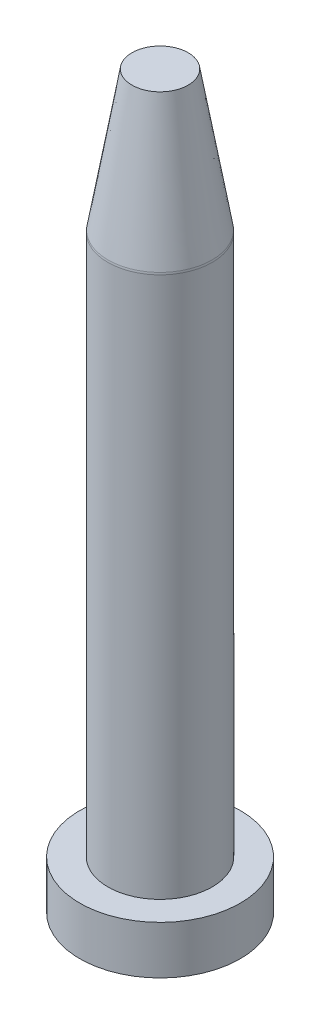
ISO-10303-21;
HEADER;
FILE_DESCRIPTION(('STEP AP214'),'2;1');
FILE_NAME('part.step','',(''),(''),'','','');
FILE_SCHEMA(('AUTOMOTIVE_DESIGN { 1 0 10303 214 1 1 1 1 }'));
ENDSEC;
DATA;
#1=APPLICATION_CONTEXT('core data for automotive mechanical design processes');
#2=APPLICATION_PROTOCOL_DEFINITION('international standard','automotive_design',2000,#1);
#3=PRODUCT_CONTEXT('',#1,'mechanical');
#4=PRODUCT('Part','Part','',(#3));
#5=PRODUCT_RELATED_PRODUCT_CATEGORY('part','',(#4));
#6=PRODUCT_DEFINITION_FORMATION('','',#4);
#7=PRODUCT_DEFINITION_CONTEXT('part definition',#1,'design');
#8=PRODUCT_DEFINITION('design','',#6,#7);
#9=PRODUCT_DEFINITION_SHAPE('','',#8);
#10=(LENGTH_UNIT() NAMED_UNIT(*) SI_UNIT(.MILLI.,.METRE.));
#11=(NAMED_UNIT(*) PLANE_ANGLE_UNIT() SI_UNIT($,.RADIAN.));
#12=(NAMED_UNIT(*) SI_UNIT($,.STERADIAN.) SOLID_ANGLE_UNIT());
#13=UNCERTAINTY_MEASURE_WITH_UNIT(LENGTH_MEASURE(1.E-05),#10,'distance_accuracy_value','');
#14=(GEOMETRIC_REPRESENTATION_CONTEXT(3) GLOBAL_UNCERTAINTY_ASSIGNED_CONTEXT((#13)) GLOBAL_UNIT_ASSIGNED_CONTEXT((#10,
#11,#12)) REPRESENTATION_CONTEXT('',''));
#15=CARTESIAN_POINT('',(0.,0.,0.));
#16=DIRECTION('',(0.,0.,1.));
#17=DIRECTION('',(1.,0.,0.));
#18=AXIS2_PLACEMENT_3D('',#15,#16,#17);
#19=CARTESIAN_POINT('',(0.,182.,0.));
#20=DIRECTION('',(0.,1.,0.));
#21=DIRECTION('',(0.,0.,1.));
#22=AXIS2_PLACEMENT_3D('',#19,#20,#21);
#23=PLANE('',#22);
#24=CARTESIAN_POINT('',(0.,182.,0.));
#25=DIRECTION('',(0.,-1.,0.));
#26=DIRECTION('',(0.,0.,-1.));
#27=AXIS2_PLACEMENT_3D('',#24,#25,#26);
#28=CIRCLE('',#27,7.);
#29=CARTESIAN_POINT('',(0.,182.,-7.));
#30=VERTEX_POINT('',#29);
#31=EDGE_CURVE('E42',#30,#30,#28,.T.);
#32=ORIENTED_EDGE('',*,*,#31,.F.);
#33=EDGE_LOOP('',(#32));
#34=FACE_BOUND('',#33,.T.);
#35=ADVANCED_FACE('F31',(#34),#23,.T.);
#36=CARTESIAN_POINT('',(0.,147.,0.));
#37=DIRECTION('',(0.,-1.,0.));
#38=DIRECTION('',(0.,0.,-1.));
#39=AXIS2_PLACEMENT_3D('',#36,#37,#38);
#40=CONICAL_SURFACE('',#39,13.,0.169778273968339);
#41=CARTESIAN_POINT('',(0.,147.251610540768,0.));
#42=DIRECTION('',(0.,1.,0.));
#43=DIRECTION('',(0.,0.,1.));
#44=AXIS2_PLACEMENT_3D('',#41,#42,#43);
#45=CIRCLE('',#44,12.9568667644398);
#46=CARTESIAN_POINT('',(0.,147.251610540768,12.9568667644398));
#47=VERTEX_POINT('',#46);
#48=EDGE_CURVE('E10',#47,#47,#45,.T.);
#49=ORIENTED_EDGE('',*,*,#48,.T.);
#50=EDGE_LOOP('',(#49));
#51=FACE_BOUND('',#50,.T.);
#52=ORIENTED_EDGE('',*,*,#31,.T.);
#53=EDGE_LOOP('',(#52));
#54=FACE_BOUND('',#53,.T.);
#55=ADVANCED_FACE('F74',(#51,#54),#40,.T.);
#56=CARTESIAN_POINT('',(0.,0.,0.));
#57=DIRECTION('',(0.,-1.,0.));
#58=DIRECTION('',(0.,0.,-1.));
#59=AXIS2_PLACEMENT_3D('',#56,#57,#58);
#60=CYLINDRICAL_SURFACE('',#59,13.);
#61=CARTESIAN_POINT('',(0.,146.744719095435,0.));
#62=DIRECTION('',(0.,1.,0.));
#63=DIRECTION('',(0.,0.,1.));
#64=AXIS2_PLACEMENT_3D('',#61,#62,#63);
#65=CIRCLE('',#64,13.);
#66=CARTESIAN_POINT('',(0.,146.744719095435,13.));
#67=VERTEX_POINT('',#66);
#68=EDGE_CURVE('E38',#67,#67,#65,.F.);
#69=ORIENTED_EDGE('',*,*,#68,.T.);
#70=EDGE_LOOP('',(#69));
#71=FACE_BOUND('',#70,.T.);
#72=CARTESIAN_POINT('',(0.,12.,0.));
#73=DIRECTION('',(0.,-1.,0.));
#74=DIRECTION('',(0.,0.,-1.));
#75=AXIS2_PLACEMENT_3D('',#72,#73,#74);
#76=CIRCLE('',#75,13.);
#77=CARTESIAN_POINT('',(0.,12.,-13.));
#78=VERTEX_POINT('',#77);
#79=EDGE_CURVE('E46',#78,#78,#76,.T.);
#80=ORIENTED_EDGE('',*,*,#79,.F.);
#81=EDGE_LOOP('',(#80));
#82=FACE_BOUND('',#81,.T.);
#83=ADVANCED_FACE('F70',(#71,#82),#60,.T.);
#84=CARTESIAN_POINT('',(20.,12.,0.));
#85=DIRECTION('',(0.,1.,0.));
#86=DIRECTION('',(0.,0.,1.));
#87=AXIS2_PLACEMENT_3D('',#84,#85,#86);
#88=PLANE('',#87);
#89=ORIENTED_EDGE('',*,*,#79,.T.);
#90=EDGE_LOOP('',(#89));
#91=FACE_BOUND('',#90,.T.);
#92=CARTESIAN_POINT('',(0.,12.,0.));
#93=DIRECTION('',(0.,-1.,0.));
#94=DIRECTION('',(0.,0.,-1.));
#95=AXIS2_PLACEMENT_3D('',#92,#93,#94);
#96=CIRCLE('',#95,20.);
#97=CARTESIAN_POINT('',(0.,12.,-20.));
#98=VERTEX_POINT('',#97);
#99=EDGE_CURVE('E51',#98,#98,#96,.T.);
#100=ORIENTED_EDGE('',*,*,#99,.F.);
#101=EDGE_LOOP('',(#100));
#102=FACE_BOUND('',#101,.T.);
#103=ADVANCED_FACE('F62',(#91,#102),#88,.T.);
#104=CARTESIAN_POINT('',(0.,0.,0.));
#105=DIRECTION('',(0.,-1.,0.));
#106=DIRECTION('',(0.,0.,-1.));
#107=AXIS2_PLACEMENT_3D('',#104,#105,#106);
#108=CYLINDRICAL_SURFACE('',#107,20.);
#109=ORIENTED_EDGE('',*,*,#99,.T.);
#110=EDGE_LOOP('',(#109));
#111=FACE_BOUND('',#110,.T.);
#112=CARTESIAN_POINT('',(0.,0.,0.));
#113=DIRECTION('',(0.,-1.,0.));
#114=DIRECTION('',(0.,0.,-1.));
#115=AXIS2_PLACEMENT_3D('',#112,#113,#114);
#116=CIRCLE('',#115,20.);
#117=CARTESIAN_POINT('',(0.,0.,-20.));
#118=VERTEX_POINT('',#117);
#119=EDGE_CURVE('E54',#118,#118,#116,.T.);
#120=ORIENTED_EDGE('',*,*,#119,.F.);
#121=EDGE_LOOP('',(#120));
#122=FACE_BOUND('',#121,.T.);
#123=ADVANCED_FACE('F60',(#111,#122),#108,.T.);
#124=CARTESIAN_POINT('',(0.,0.,0.));
#125=DIRECTION('',(0.,-1.,0.));
#126=DIRECTION('',(0.,0.,-1.));
#127=AXIS2_PLACEMENT_3D('',#124,#125,#126);
#128=PLANE('',#127);
#129=ORIENTED_EDGE('',*,*,#119,.T.);
#130=EDGE_LOOP('',(#129));
#131=FACE_BOUND('',#130,.T.);
#132=ADVANCED_FACE('F58',(#131),#128,.T.);
#133=CARTESIAN_POINT('',(0.,146.744719095435,0.));
#134=DIRECTION('',(0.,1.,0.));
#135=DIRECTION('',(0.,0.,1.));
#136=AXIS2_PLACEMENT_3D('',#133,#134,#135);
#137=TOROIDAL_SURFACE('',#136,10.,3.);
#138=ORIENTED_EDGE('',*,*,#48,.F.);
#139=EDGE_LOOP('',(#138));
#140=FACE_BOUND('',#139,.T.);
#141=ORIENTED_EDGE('',*,*,#68,.F.);
#142=EDGE_LOOP('',(#141));
#143=FACE_BOUND('',#142,.T.);
#144=ADVANCED_FACE('F33',(#140,#143),#137,.T.);
#145=CLOSED_SHELL('',(#35,#55,#83,#103,#123,#132,#144));
#146=MANIFOLD_SOLID_BREP('B2',#145);
#147=ADVANCED_BREP_SHAPE_REPRESENTATION('',(#18,#146),#14);
#148=SHAPE_DEFINITION_REPRESENTATION(#9,#147);
ENDSEC;
END-ISO-10303-21;
